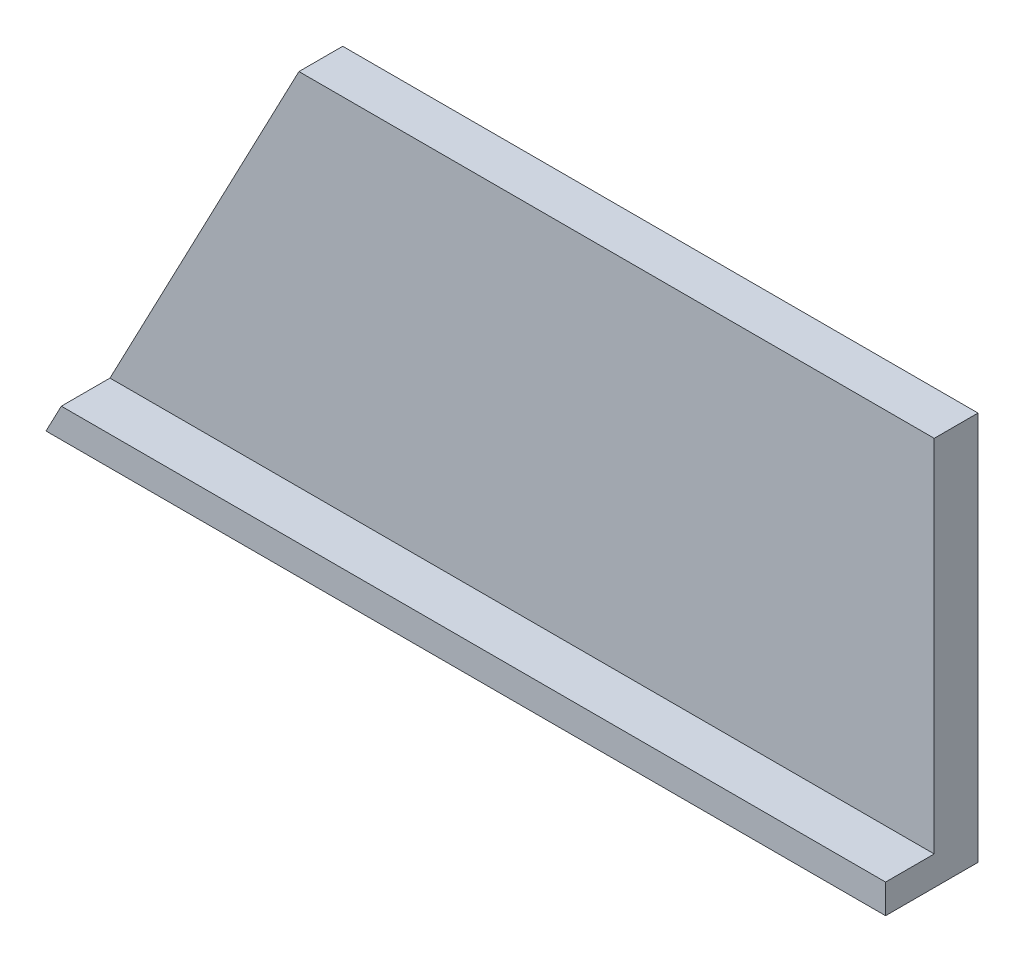
ISO-10303-21;
HEADER;
FILE_DESCRIPTION(('STEP AP214'),'2;1');
FILE_NAME('part.step','',(''),(''),'','','');
FILE_SCHEMA(('AUTOMOTIVE_DESIGN { 1 0 10303 214 1 1 1 1 }'));
ENDSEC;
DATA;
#1=APPLICATION_CONTEXT('core data for automotive mechanical design processes');
#2=APPLICATION_PROTOCOL_DEFINITION('international standard','automotive_design',2000,#1);
#3=PRODUCT_CONTEXT('',#1,'mechanical');
#4=PRODUCT('Part','Part','',(#3));
#5=PRODUCT_RELATED_PRODUCT_CATEGORY('part','',(#4));
#6=PRODUCT_DEFINITION_FORMATION('','',#4);
#7=PRODUCT_DEFINITION_CONTEXT('part definition',#1,'design');
#8=PRODUCT_DEFINITION('design','',#6,#7);
#9=PRODUCT_DEFINITION_SHAPE('','',#8);
#10=(LENGTH_UNIT() NAMED_UNIT(*) SI_UNIT(.MILLI.,.METRE.));
#11=(NAMED_UNIT(*) PLANE_ANGLE_UNIT() SI_UNIT($,.RADIAN.));
#12=(NAMED_UNIT(*) SI_UNIT($,.STERADIAN.) SOLID_ANGLE_UNIT());
#13=UNCERTAINTY_MEASURE_WITH_UNIT(LENGTH_MEASURE(1.E-05),#10,'distance_accuracy_value','');
#14=(GEOMETRIC_REPRESENTATION_CONTEXT(3) GLOBAL_UNCERTAINTY_ASSIGNED_CONTEXT((#13)) GLOBAL_UNIT_ASSIGNED_CONTEXT((#10,
#11,#12)) REPRESENTATION_CONTEXT('',''));
#15=CARTESIAN_POINT('',(0.,0.,0.));
#16=DIRECTION('',(0.,0.,1.));
#17=DIRECTION('',(1.,0.,0.));
#18=AXIS2_PLACEMENT_3D('',#15,#16,#17);
#19=CARTESIAN_POINT('',(-21.,4.5,-3.20000000000006));
#20=DIRECTION('',(0.,1.,0.));
#21=DIRECTION('',(0.,0.,1.));
#22=AXIS2_PLACEMENT_3D('',#19,#20,#21);
#23=PLANE('',#22);
#24=DIRECTION('',(0.,0.,1.));
#25=VECTOR('',#24,1.);
#26=CARTESIAN_POINT('',(65.3,4.5,0.));
#27=LINE('',#26,#25);
#28=CARTESIAN_POINT('',(65.3,4.5,0.));
#29=VERTEX_POINT('',#28);
#30=CARTESIAN_POINT('',(65.3,4.5,9.5));
#31=VERTEX_POINT('',#30);
#32=EDGE_CURVE('E52',#29,#31,#27,.T.);
#33=ORIENTED_EDGE('',*,*,#32,.T.);
#34=DIRECTION('',(1.,0.,0.));
#35=VECTOR('',#34,1.);
#36=CARTESIAN_POINT('',(-21.,4.5,9.5));
#37=LINE('',#36,#35);
#38=CARTESIAN_POINT('',(-21.,4.5,9.5));
#39=VERTEX_POINT('',#38);
#40=EDGE_CURVE('E100',#39,#31,#37,.T.);
#41=ORIENTED_EDGE('',*,*,#40,.F.);
#42=DIRECTION('',(0.,0.,1.));
#43=VECTOR('',#42,1.);
#44=CARTESIAN_POINT('',(-21.,4.5,0.));
#45=LINE('',#44,#43);
#46=CARTESIAN_POINT('',(-21.,4.5,0.));
#47=VERTEX_POINT('',#46);
#48=EDGE_CURVE('E44',#47,#39,#45,.T.);
#49=ORIENTED_EDGE('',*,*,#48,.F.);
#50=DIRECTION('',(-1.,0.,0.));
#51=VECTOR('',#50,1.);
#52=CARTESIAN_POINT('',(0.,4.5,0.));
#53=LINE('',#52,#51);
#54=EDGE_CURVE('E130',#29,#47,#53,.T.);
#55=ORIENTED_EDGE('',*,*,#54,.F.);
#56=EDGE_LOOP('',(#33,#41,#49,#55));
#57=FACE_BOUND('',#56,.T.);
#58=ADVANCED_FACE('F36',(#57),#23,.F.);
#59=CARTESIAN_POINT('',(154.825,7.5,9.5));
#60=DIRECTION('',(0.,-1.,0.));
#61=DIRECTION('',(1.,0.,0.));
#62=AXIS2_PLACEMENT_3D('',#59,#60,#61);
#63=PLANE('',#62);
#64=DIRECTION('',(-1.,0.,0.));
#65=VECTOR('',#64,1.);
#66=CARTESIAN_POINT('',(154.825,7.5,9.5));
#67=LINE('',#66,#65);
#68=CARTESIAN_POINT('',(65.3,7.49999999999999,9.5));
#69=VERTEX_POINT('',#68);
#70=CARTESIAN_POINT('',(-19.425,7.49999999999998,9.5));
#71=VERTEX_POINT('',#70);
#72=EDGE_CURVE('E105',#69,#71,#67,.T.);
#73=ORIENTED_EDGE('',*,*,#72,.F.);
#74=DIRECTION('',(0.,0.,-1.));
#75=VECTOR('',#74,1.);
#76=CARTESIAN_POINT('',(65.3,7.49999999999999,9.5));
#77=LINE('',#76,#75);
#78=CARTESIAN_POINT('',(65.3,7.49999999999999,4.5));
#79=VERTEX_POINT('',#78);
#80=EDGE_CURVE('E60',#69,#79,#77,.T.);
#81=ORIENTED_EDGE('',*,*,#80,.T.);
#82=DIRECTION('',(-1.,0.,0.));
#83=VECTOR('',#82,1.);
#84=CARTESIAN_POINT('',(154.825,7.5,4.5));
#85=LINE('',#84,#83);
#86=CARTESIAN_POINT('',(-19.425,7.49999999999998,4.5));
#87=VERTEX_POINT('',#86);
#88=EDGE_CURVE('E114',#79,#87,#85,.T.);
#89=ORIENTED_EDGE('',*,*,#88,.T.);
#90=DIRECTION('',(0.,0.,-1.));
#91=VECTOR('',#90,1.);
#92=CARTESIAN_POINT('',(-19.425,7.49999999999998,9.5));
#93=LINE('',#92,#91);
#94=EDGE_CURVE('E12',#71,#87,#93,.T.);
#95=ORIENTED_EDGE('',*,*,#94,.F.);
#96=EDGE_LOOP('',(#73,#81,#89,#95));
#97=FACE_BOUND('',#96,.T.);
#98=ADVANCED_FACE('F154',(#97),#63,.F.);
#99=CARTESIAN_POINT('',(0.,0.,9.5));
#100=DIRECTION('',(0.,0.,1.));
#101=DIRECTION('',(1.,0.,0.));
#102=AXIS2_PLACEMENT_3D('',#99,#100,#101);
#103=PLANE('',#102);
#104=DIRECTION('',(0.,1.,0.));
#105=VECTOR('',#104,1.);
#106=CARTESIAN_POINT('',(65.3,7.49999999999999,9.5));
#107=LINE('',#106,#105);
#108=EDGE_CURVE('E108',#31,#69,#107,.T.);
#109=ORIENTED_EDGE('',*,*,#108,.T.);
#110=ORIENTED_EDGE('',*,*,#72,.T.);
#111=DIRECTION('',(-0.46483389898992,-0.885397902837944,0.));
#112=VECTOR('',#111,1.);
#113=CARTESIAN_POINT('',(-19.425,7.49999999999998,9.5));
#114=LINE('',#113,#112);
#115=EDGE_CURVE('E93',#71,#39,#114,.T.);
#116=ORIENTED_EDGE('',*,*,#115,.T.);
#117=ORIENTED_EDGE('',*,*,#40,.T.);
#118=EDGE_LOOP('',(#109,#110,#116,#117));
#119=FACE_BOUND('',#118,.T.);
#120=ADVANCED_FACE('F103',(#119),#103,.T.);
#121=CARTESIAN_POINT('',(0.,44.5,4.5));
#122=DIRECTION('',(0.,0.,-1.));
#123=DIRECTION('',(-1.,0.,0.));
#124=AXIS2_PLACEMENT_3D('',#121,#122,#123);
#125=PLANE('',#124);
#126=ORIENTED_EDGE('',*,*,#88,.F.);
#127=DIRECTION('',(0.,-1.,0.));
#128=VECTOR('',#127,1.);
#129=CARTESIAN_POINT('',(65.3,4.5,4.5));
#130=LINE('',#129,#128);
#131=CARTESIAN_POINT('',(65.3,44.5,4.5));
#132=VERTEX_POINT('',#131);
#133=EDGE_CURVE('E131',#132,#79,#130,.T.);
#134=ORIENTED_EDGE('',*,*,#133,.F.);
#135=DIRECTION('',(1.,0.,0.));
#136=VECTOR('',#135,1.);
#137=CARTESIAN_POINT('',(0.,44.5,4.5));
#138=LINE('',#137,#136);
#139=CARTESIAN_POINT('',(0.,44.5,4.5));
#140=VERTEX_POINT('',#139);
#141=EDGE_CURVE('E136',#140,#132,#138,.T.);
#142=ORIENTED_EDGE('',*,*,#141,.F.);
#143=DIRECTION('',(-0.46483389898992,-0.885397902837944,0.));
#144=VECTOR('',#143,1.);
#145=CARTESIAN_POINT('',(0.,44.5,4.5));
#146=LINE('',#145,#144);
#147=EDGE_CURVE('E102',#140,#87,#146,.T.);
#148=ORIENTED_EDGE('',*,*,#147,.T.);
#149=EDGE_LOOP('',(#126,#134,#142,#148));
#150=FACE_BOUND('',#149,.T.);
#151=ADVANCED_FACE('F153',(#150),#125,.F.);
#152=CARTESIAN_POINT('',(0.,4.5,0.));
#153=DIRECTION('',(0.,0.,1.));
#154=DIRECTION('',(1.,0.,0.));
#155=AXIS2_PLACEMENT_3D('',#152,#153,#154);
#156=PLANE('',#155);
#157=DIRECTION('',(0.,-1.,0.));
#158=VECTOR('',#157,1.);
#159=CARTESIAN_POINT('',(65.3,4.5,0.));
#160=LINE('',#159,#158);
#161=CARTESIAN_POINT('',(65.3,44.5,0.));
#162=VERTEX_POINT('',#161);
#163=EDGE_CURVE('E123',#162,#29,#160,.T.);
#164=ORIENTED_EDGE('',*,*,#163,.T.);
#165=ORIENTED_EDGE('',*,*,#54,.T.);
#166=DIRECTION('',(0.46483389898992,0.885397902837944,0.));
#167=VECTOR('',#166,1.);
#168=CARTESIAN_POINT('',(0.,44.5,0.));
#169=LINE('',#168,#167);
#170=CARTESIAN_POINT('',(0.,44.5,0.));
#171=VERTEX_POINT('',#170);
#172=EDGE_CURVE('E95',#47,#171,#169,.T.);
#173=ORIENTED_EDGE('',*,*,#172,.T.);
#174=DIRECTION('',(-1.,0.,0.));
#175=VECTOR('',#174,1.);
#176=CARTESIAN_POINT('',(0.,44.5,0.));
#177=LINE('',#176,#175);
#178=EDGE_CURVE('E132',#162,#171,#177,.T.);
#179=ORIENTED_EDGE('',*,*,#178,.F.);
#180=EDGE_LOOP('',(#164,#165,#173,#179));
#181=FACE_BOUND('',#180,.T.);
#182=ADVANCED_FACE('F144',(#181),#156,.F.);
#183=CARTESIAN_POINT('',(0.,44.5,0.));
#184=DIRECTION('',(0.,1.,0.));
#185=DIRECTION('',(0.,0.,1.));
#186=AXIS2_PLACEMENT_3D('',#183,#184,#185);
#187=PLANE('',#186);
#188=DIRECTION('',(0.,0.,1.));
#189=VECTOR('',#188,1.);
#190=CARTESIAN_POINT('',(0.,44.5,0.));
#191=LINE('',#190,#189);
#192=EDGE_CURVE('E124',#171,#140,#191,.T.);
#193=ORIENTED_EDGE('',*,*,#192,.T.);
#194=ORIENTED_EDGE('',*,*,#141,.T.);
#195=DIRECTION('',(0.,0.,1.));
#196=VECTOR('',#195,1.);
#197=CARTESIAN_POINT('',(65.3,44.5,0.));
#198=LINE('',#197,#196);
#199=EDGE_CURVE('E97',#162,#132,#198,.T.);
#200=ORIENTED_EDGE('',*,*,#199,.F.);
#201=ORIENTED_EDGE('',*,*,#178,.T.);
#202=EDGE_LOOP('',(#193,#194,#200,#201));
#203=FACE_BOUND('',#202,.T.);
#204=ADVANCED_FACE('F150',(#203),#187,.T.);
#205=CARTESIAN_POINT('',(65.3,4.5,0.));
#206=DIRECTION('',(-1.,0.,0.));
#207=DIRECTION('',(0.,-1.,0.));
#208=AXIS2_PLACEMENT_3D('',#205,#206,#207);
#209=PLANE('',#208);
#210=ORIENTED_EDGE('',*,*,#133,.T.);
#211=ORIENTED_EDGE('',*,*,#80,.F.);
#212=ORIENTED_EDGE('',*,*,#108,.F.);
#213=ORIENTED_EDGE('',*,*,#32,.F.);
#214=ORIENTED_EDGE('',*,*,#163,.F.);
#215=ORIENTED_EDGE('',*,*,#199,.T.);
#216=EDGE_LOOP('',(#210,#211,#212,#213,#214,#215));
#217=FACE_BOUND('',#216,.T.);
#218=ADVANCED_FACE('F145',(#217),#209,.F.);
#219=CARTESIAN_POINT('',(0.,44.5,0.));
#220=DIRECTION('',(0.885397902837944,-0.46483389898992,0.));
#221=DIRECTION('',(0.46483389898992,0.885397902837944,0.));
#222=AXIS2_PLACEMENT_3D('',#219,#220,#221);
#223=PLANE('',#222);
#224=ORIENTED_EDGE('',*,*,#192,.F.);
#225=ORIENTED_EDGE('',*,*,#172,.F.);
#226=ORIENTED_EDGE('',*,*,#48,.T.);
#227=ORIENTED_EDGE('',*,*,#115,.F.);
#228=ORIENTED_EDGE('',*,*,#94,.T.);
#229=ORIENTED_EDGE('',*,*,#147,.F.);
#230=EDGE_LOOP('',(#224,#225,#226,#227,#228,#229));
#231=FACE_BOUND('',#230,.T.);
#232=ADVANCED_FACE('F91',(#231),#223,.F.);
#233=CLOSED_SHELL('',(#58,#98,#120,#151,#182,#204,#218,#232));
#234=MANIFOLD_SOLID_BREP('B2',#233);
#235=ADVANCED_BREP_SHAPE_REPRESENTATION('',(#18,#234),#14);
#236=SHAPE_DEFINITION_REPRESENTATION(#9,#235);
ENDSEC;
END-ISO-10303-21;
